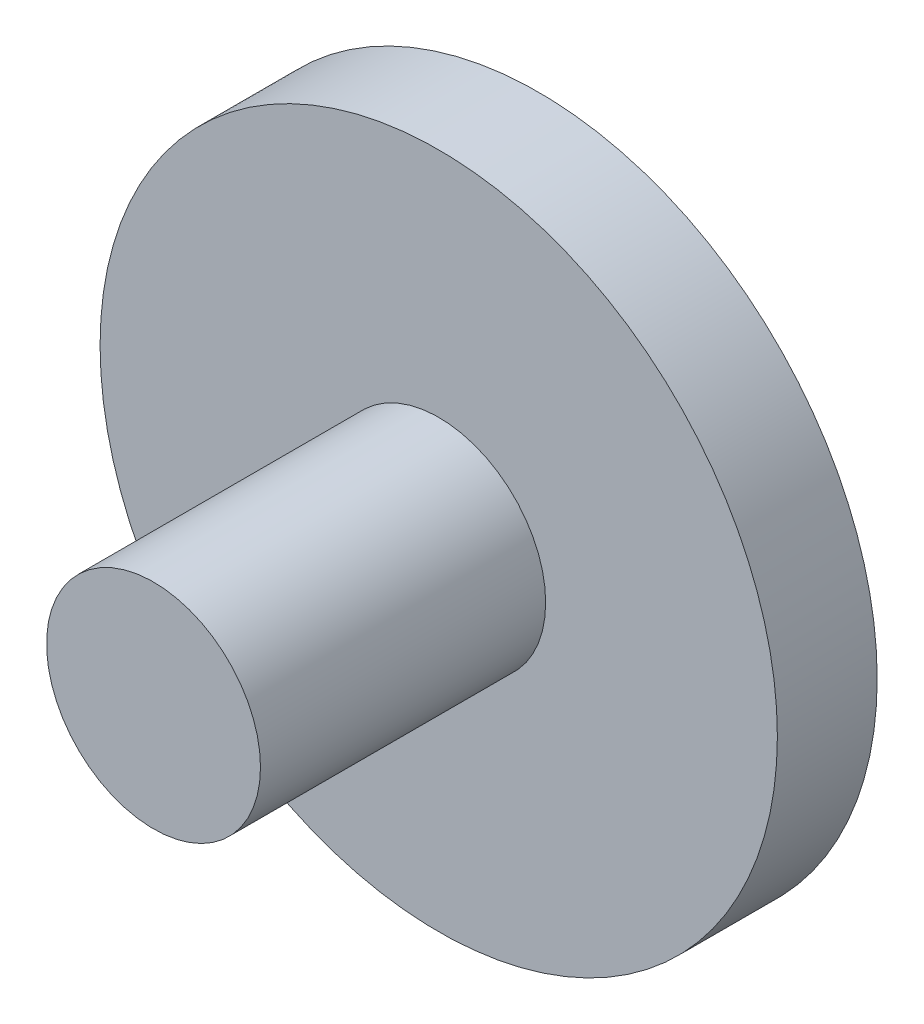
ISO-10303-21;
HEADER;
FILE_DESCRIPTION(('STEP AP214'),'2;1');
FILE_NAME('part.step','',(''),(''),'','','');
FILE_SCHEMA(('AUTOMOTIVE_DESIGN { 1 0 10303 214 1 1 1 1 }'));
ENDSEC;
DATA;
#1=APPLICATION_CONTEXT('core data for automotive mechanical design processes');
#2=APPLICATION_PROTOCOL_DEFINITION('international standard','automotive_design',2000,#1);
#3=PRODUCT_CONTEXT('',#1,'mechanical');
#4=PRODUCT('Part','Part','',(#3));
#5=PRODUCT_RELATED_PRODUCT_CATEGORY('part','',(#4));
#6=PRODUCT_DEFINITION_FORMATION('','',#4);
#7=PRODUCT_DEFINITION_CONTEXT('part definition',#1,'design');
#8=PRODUCT_DEFINITION('design','',#6,#7);
#9=PRODUCT_DEFINITION_SHAPE('','',#8);
#10=(LENGTH_UNIT() NAMED_UNIT(*) SI_UNIT(.MILLI.,.METRE.));
#11=(NAMED_UNIT(*) PLANE_ANGLE_UNIT() SI_UNIT($,.RADIAN.));
#12=(NAMED_UNIT(*) SI_UNIT($,.STERADIAN.) SOLID_ANGLE_UNIT());
#13=UNCERTAINTY_MEASURE_WITH_UNIT(LENGTH_MEASURE(1.E-05),#10,'distance_accuracy_value','');
#14=(GEOMETRIC_REPRESENTATION_CONTEXT(3) GLOBAL_UNCERTAINTY_ASSIGNED_CONTEXT((#13)) GLOBAL_UNIT_ASSIGNED_CONTEXT((#10,
#11,#12)) REPRESENTATION_CONTEXT('',''));
#15=CARTESIAN_POINT('',(0.,0.,0.));
#16=DIRECTION('',(0.,0.,1.));
#17=DIRECTION('',(1.,0.,0.));
#18=AXIS2_PLACEMENT_3D('',#15,#16,#17);
#19=CARTESIAN_POINT('',(0.,0.,0.));
#20=DIRECTION('',(0.,0.,1.));
#21=DIRECTION('',(1.,0.,0.));
#22=AXIS2_PLACEMENT_3D('',#19,#20,#21);
#23=PLANE('',#22);
#24=CARTESIAN_POINT('',(0.,0.,0.));
#25=DIRECTION('',(0.,0.,1.));
#26=DIRECTION('',(1.,0.,0.));
#27=AXIS2_PLACEMENT_3D('',#24,#25,#26);
#28=CIRCLE('',#27,4.75);
#29=CARTESIAN_POINT('',(4.75,0.,0.));
#30=VERTEX_POINT('',#29);
#31=EDGE_CURVE('E40',#30,#30,#28,.T.);
#32=ORIENTED_EDGE('',*,*,#31,.F.);
#33=EDGE_LOOP('',(#32));
#34=FACE_BOUND('',#33,.T.);
#35=DIRECTION('',(0.,1.,0.));
#36=VECTOR('',#35,1.);
#37=CARTESIAN_POINT('',(0.380174061926655,0.,0.));
#38=LINE('',#37,#36);
#39=CARTESIAN_POINT('',(0.380174061926655,0.31229172491184,0.));
#40=VERTEX_POINT('',#39);
#41=CARTESIAN_POINT('',(0.380174061926655,2.58391492168923,0.));
#42=VERTEX_POINT('',#41);
#43=EDGE_CURVE('E51',#40,#42,#38,.T.);
#44=ORIENTED_EDGE('',*,*,#43,.T.);
#45=DIRECTION('',(-1.,0.,0.));
#46=VECTOR('',#45,1.);
#47=CARTESIAN_POINT('',(0.,2.58391492168923,0.));
#48=LINE('',#47,#46);
#49=CARTESIAN_POINT('',(-0.380174061926655,2.58391492168923,0.));
#50=VERTEX_POINT('',#49);
#51=EDGE_CURVE('E101',#42,#50,#48,.T.);
#52=ORIENTED_EDGE('',*,*,#51,.T.);
#53=DIRECTION('',(0.,1.,0.));
#54=VECTOR('',#53,1.);
#55=CARTESIAN_POINT('',(-0.380174061926655,0.,0.));
#56=LINE('',#55,#54);
#57=CARTESIAN_POINT('',(-0.380174061926655,0.31229172491184,0.));
#58=VERTEX_POINT('',#57);
#59=EDGE_CURVE('E189',#58,#50,#56,.T.);
#60=ORIENTED_EDGE('',*,*,#59,.F.);
#61=DIRECTION('',(-1.,0.,0.));
#62=VECTOR('',#61,1.);
#63=CARTESIAN_POINT('',(0.,0.31229172491184,0.));
#64=LINE('',#63,#62);
#65=CARTESIAN_POINT('',(-1.51598566031535,0.31229172491184,0.));
#66=VERTEX_POINT('',#65);
#67=EDGE_CURVE('E141',#58,#66,#64,.T.);
#68=ORIENTED_EDGE('',*,*,#67,.T.);
#69=DIRECTION('',(0.,1.,0.));
#70=VECTOR('',#69,1.);
#71=CARTESIAN_POINT('',(-1.51598566031535,0.,0.));
#72=LINE('',#71,#70);
#73=CARTESIAN_POINT('',(-1.51598566031535,-0.312291724911838,0.));
#74=VERTEX_POINT('',#73);
#75=EDGE_CURVE('E185',#74,#66,#72,.T.);
#76=ORIENTED_EDGE('',*,*,#75,.F.);
#77=DIRECTION('',(-1.,0.,0.));
#78=VECTOR('',#77,1.);
#79=CARTESIAN_POINT('',(0.,-0.312291724911838,0.));
#80=LINE('',#79,#78);
#81=CARTESIAN_POINT('',(-0.380174061926655,-0.312291724911838,0.));
#82=VERTEX_POINT('',#81);
#83=EDGE_CURVE('E182',#82,#74,#80,.T.);
#84=ORIENTED_EDGE('',*,*,#83,.F.);
#85=DIRECTION('',(0.,1.,0.));
#86=VECTOR('',#85,1.);
#87=CARTESIAN_POINT('',(-0.380174061926655,0.,0.));
#88=LINE('',#87,#86);
#89=CARTESIAN_POINT('',(-0.380174061926655,-2.58391492168923,0.));
#90=VERTEX_POINT('',#89);
#91=EDGE_CURVE('E179',#90,#82,#88,.T.);
#92=ORIENTED_EDGE('',*,*,#91,.F.);
#93=DIRECTION('',(-1.,0.,0.));
#94=VECTOR('',#93,1.);
#95=CARTESIAN_POINT('',(0.,-2.58391492168923,0.));
#96=LINE('',#95,#94);
#97=CARTESIAN_POINT('',(0.380174061926655,-2.58391492168923,0.));
#98=VERTEX_POINT('',#97);
#99=EDGE_CURVE('E176',#98,#90,#96,.T.);
#100=ORIENTED_EDGE('',*,*,#99,.F.);
#101=DIRECTION('',(0.,1.,0.));
#102=VECTOR('',#101,1.);
#103=CARTESIAN_POINT('',(0.380174061926655,0.,0.));
#104=LINE('',#103,#102);
#105=CARTESIAN_POINT('',(0.380174061926655,-0.312291724911838,0.));
#106=VERTEX_POINT('',#105);
#107=EDGE_CURVE('E173',#98,#106,#104,.T.);
#108=ORIENTED_EDGE('',*,*,#107,.T.);
#109=DIRECTION('',(-1.,0.,0.));
#110=VECTOR('',#109,1.);
#111=CARTESIAN_POINT('',(0.,-0.312291724911838,0.));
#112=LINE('',#111,#110);
#113=CARTESIAN_POINT('',(1.51598566031535,-0.312291724911838,0.));
#114=VERTEX_POINT('',#113);
#115=EDGE_CURVE('E170',#114,#106,#112,.T.);
#116=ORIENTED_EDGE('',*,*,#115,.F.);
#117=DIRECTION('',(0.,1.,0.));
#118=VECTOR('',#117,1.);
#119=CARTESIAN_POINT('',(1.51598566031535,0.,0.));
#120=LINE('',#119,#118);
#121=CARTESIAN_POINT('',(1.51598566031535,0.31229172491184,0.));
#122=VERTEX_POINT('',#121);
#123=EDGE_CURVE('E167',#114,#122,#120,.T.);
#124=ORIENTED_EDGE('',*,*,#123,.T.);
#125=DIRECTION('',(-1.,0.,0.));
#126=VECTOR('',#125,1.);
#127=CARTESIAN_POINT('',(0.,0.31229172491184,0.));
#128=LINE('',#127,#126);
#129=EDGE_CURVE('E164',#122,#40,#128,.T.);
#130=ORIENTED_EDGE('',*,*,#129,.T.);
#131=EDGE_LOOP('',(#44,#52,#60,#68,#76,#84,#92,#100,#108,#116,#124,#130));
#132=FACE_BOUND('',#131,.T.);
#133=ADVANCED_FACE('F36',(#34,#132),#23,.F.);
#134=CARTESIAN_POINT('',(0.,0.,1.4));
#135=DIRECTION('',(0.,0.,-1.));
#136=DIRECTION('',(-1.,0.,0.));
#137=AXIS2_PLACEMENT_3D('',#134,#135,#136);
#138=CYLINDRICAL_SURFACE('',#137,4.75);
#139=CARTESIAN_POINT('',(0.,0.,1.4));
#140=DIRECTION('',(0.,0.,1.));
#141=DIRECTION('',(1.,0.,0.));
#142=AXIS2_PLACEMENT_3D('',#139,#140,#141);
#143=CIRCLE('',#142,4.75);
#144=CARTESIAN_POINT('',(4.75,0.,1.4));
#145=VERTEX_POINT('',#144);
#146=EDGE_CURVE('E11',#145,#145,#143,.T.);
#147=ORIENTED_EDGE('',*,*,#146,.F.);
#148=EDGE_LOOP('',(#147));
#149=FACE_BOUND('',#148,.T.);
#150=ORIENTED_EDGE('',*,*,#31,.T.);
#151=EDGE_LOOP('',(#150));
#152=FACE_BOUND('',#151,.T.);
#153=ADVANCED_FACE('F38',(#149,#152),#138,.T.);
#154=CARTESIAN_POINT('',(0.,0.,1.4));
#155=DIRECTION('',(0.,0.,1.));
#156=DIRECTION('',(1.,0.,0.));
#157=AXIS2_PLACEMENT_3D('',#154,#155,#156);
#158=PLANE('',#157);
#159=CARTESIAN_POINT('',(0.,0.,1.4));
#160=DIRECTION('',(0.,0.,1.));
#161=DIRECTION('',(1.,0.,0.));
#162=AXIS2_PLACEMENT_3D('',#159,#160,#161);
#163=CIRCLE('',#162,1.5);
#164=CARTESIAN_POINT('',(1.5,0.,1.4));
#165=VERTEX_POINT('',#164);
#166=EDGE_CURVE('E195',#165,#165,#163,.T.);
#167=ORIENTED_EDGE('',*,*,#166,.F.);
#168=EDGE_LOOP('',(#167));
#169=FACE_BOUND('',#168,.T.);
#170=ORIENTED_EDGE('',*,*,#146,.T.);
#171=EDGE_LOOP('',(#170));
#172=FACE_BOUND('',#171,.T.);
#173=ADVANCED_FACE('F221',(#169,#172),#158,.T.);
#174=CARTESIAN_POINT('',(0.,0.,5.4));
#175=DIRECTION('',(0.,0.,-1.));
#176=DIRECTION('',(-1.,0.,0.));
#177=AXIS2_PLACEMENT_3D('',#174,#175,#176);
#178=CYLINDRICAL_SURFACE('',#177,1.5);
#179=CARTESIAN_POINT('',(0.,0.,5.4));
#180=DIRECTION('',(0.,0.,1.));
#181=DIRECTION('',(1.,0.,0.));
#182=AXIS2_PLACEMENT_3D('',#179,#180,#181);
#183=CIRCLE('',#182,1.5);
#184=CARTESIAN_POINT('',(1.5,0.,5.4));
#185=VERTEX_POINT('',#184);
#186=EDGE_CURVE('E213',#185,#185,#183,.T.);
#187=ORIENTED_EDGE('',*,*,#186,.F.);
#188=EDGE_LOOP('',(#187));
#189=FACE_BOUND('',#188,.T.);
#190=ORIENTED_EDGE('',*,*,#166,.T.);
#191=EDGE_LOOP('',(#190));
#192=FACE_BOUND('',#191,.T.);
#193=ADVANCED_FACE('F219',(#189,#192),#178,.T.);
#194=CARTESIAN_POINT('',(0.,0.,5.4));
#195=DIRECTION('',(0.,0.,1.));
#196=DIRECTION('',(1.,0.,0.));
#197=AXIS2_PLACEMENT_3D('',#194,#195,#196);
#198=PLANE('',#197);
#199=ORIENTED_EDGE('',*,*,#186,.T.);
#200=EDGE_LOOP('',(#199));
#201=FACE_BOUND('',#200,.T.);
#202=ADVANCED_FACE('F295',(#201),#198,.T.);
#203=CARTESIAN_POINT('',(0.380174061926655,0.,1.));
#204=DIRECTION('',(-1.,0.,0.));
#205=DIRECTION('',(0.,0.,1.));
#206=AXIS2_PLACEMENT_3D('',#203,#204,#205);
#207=PLANE('',#206);
#208=ORIENTED_EDGE('',*,*,#43,.F.);
#209=DIRECTION('',(0.,0.,-1.));
#210=VECTOR('',#209,1.);
#211=CARTESIAN_POINT('',(0.380174061926655,0.31229172491184,1.));
#212=LINE('',#211,#210);
#213=CARTESIAN_POINT('',(0.380174061926655,0.31229172491184,1.));
#214=VERTEX_POINT('',#213);
#215=EDGE_CURVE('E159',#214,#40,#212,.T.);
#216=ORIENTED_EDGE('',*,*,#215,.F.);
#217=DIRECTION('',(0.,1.,0.));
#218=VECTOR('',#217,1.);
#219=CARTESIAN_POINT('',(0.380174061926655,0.,1.));
#220=LINE('',#219,#218);
#221=CARTESIAN_POINT('',(0.380174061926655,2.58391492168923,1.));
#222=VERTEX_POINT('',#221);
#223=EDGE_CURVE('E192',#214,#222,#220,.T.);
#224=ORIENTED_EDGE('',*,*,#223,.T.);
#225=DIRECTION('',(0.,0.,-1.));
#226=VECTOR('',#225,1.);
#227=CARTESIAN_POINT('',(0.380174061926655,2.58391492168923,1.));
#228=LINE('',#227,#226);
#229=EDGE_CURVE('E193',#222,#42,#228,.T.);
#230=ORIENTED_EDGE('',*,*,#229,.T.);
#231=EDGE_LOOP('',(#208,#216,#224,#230));
#232=FACE_BOUND('',#231,.T.);
#233=ADVANCED_FACE('F238',(#232),#207,.T.);
#234=CARTESIAN_POINT('',(0.,2.58391492168923,1.));
#235=DIRECTION('',(0.,-1.,0.));
#236=DIRECTION('',(0.,0.,-1.));
#237=AXIS2_PLACEMENT_3D('',#234,#235,#236);
#238=PLANE('',#237);
#239=ORIENTED_EDGE('',*,*,#51,.F.);
#240=ORIENTED_EDGE('',*,*,#229,.F.);
#241=DIRECTION('',(-1.,0.,0.));
#242=VECTOR('',#241,1.);
#243=CARTESIAN_POINT('',(0.,2.58391492168923,1.));
#244=LINE('',#243,#242);
#245=CARTESIAN_POINT('',(-0.380174061926655,2.58391492168923,1.));
#246=VERTEX_POINT('',#245);
#247=EDGE_CURVE('E60',#222,#246,#244,.T.);
#248=ORIENTED_EDGE('',*,*,#247,.T.);
#249=DIRECTION('',(0.,0.,-1.));
#250=VECTOR('',#249,1.);
#251=CARTESIAN_POINT('',(-0.380174061926655,2.58391492168923,1.));
#252=LINE('',#251,#250);
#253=EDGE_CURVE('E146',#246,#50,#252,.T.);
#254=ORIENTED_EDGE('',*,*,#253,.T.);
#255=EDGE_LOOP('',(#239,#240,#248,#254));
#256=FACE_BOUND('',#255,.T.);
#257=ADVANCED_FACE('F294',(#256),#238,.T.);
#258=CARTESIAN_POINT('',(-0.380174061926655,0.,1.));
#259=DIRECTION('',(-1.,0.,0.));
#260=DIRECTION('',(0.,0.,1.));
#261=AXIS2_PLACEMENT_3D('',#258,#259,#260);
#262=PLANE('',#261);
#263=ORIENTED_EDGE('',*,*,#59,.T.);
#264=ORIENTED_EDGE('',*,*,#253,.F.);
#265=DIRECTION('',(0.,1.,0.));
#266=VECTOR('',#265,1.);
#267=CARTESIAN_POINT('',(-0.380174061926655,0.,1.));
#268=LINE('',#267,#266);
#269=CARTESIAN_POINT('',(-0.380174061926655,0.31229172491184,1.));
#270=VERTEX_POINT('',#269);
#271=EDGE_CURVE('E151',#270,#246,#268,.T.);
#272=ORIENTED_EDGE('',*,*,#271,.F.);
#273=DIRECTION('',(0.,0.,-1.));
#274=VECTOR('',#273,1.);
#275=CARTESIAN_POINT('',(-0.380174061926655,0.31229172491184,1.));
#276=LINE('',#275,#274);
#277=EDGE_CURVE('E135',#270,#58,#276,.T.);
#278=ORIENTED_EDGE('',*,*,#277,.T.);
#279=EDGE_LOOP('',(#263,#264,#272,#278));
#280=FACE_BOUND('',#279,.T.);
#281=ADVANCED_FACE('F157',(#280),#262,.F.);
#282=CARTESIAN_POINT('',(0.,0.31229172491184,1.));
#283=DIRECTION('',(0.,-1.,0.));
#284=DIRECTION('',(0.,0.,-1.));
#285=AXIS2_PLACEMENT_3D('',#282,#283,#284);
#286=PLANE('',#285);
#287=ORIENTED_EDGE('',*,*,#67,.F.);
#288=ORIENTED_EDGE('',*,*,#277,.F.);
#289=DIRECTION('',(-1.,0.,0.));
#290=VECTOR('',#289,1.);
#291=CARTESIAN_POINT('',(0.,0.31229172491184,1.));
#292=LINE('',#291,#290);
#293=CARTESIAN_POINT('',(-1.51598566031535,0.31229172491184,1.));
#294=VERTEX_POINT('',#293);
#295=EDGE_CURVE('E138',#270,#294,#292,.T.);
#296=ORIENTED_EDGE('',*,*,#295,.T.);
#297=DIRECTION('',(0.,0.,-1.));
#298=VECTOR('',#297,1.);
#299=CARTESIAN_POINT('',(-1.51598566031535,0.31229172491184,1.));
#300=LINE('',#299,#298);
#301=EDGE_CURVE('E147',#294,#66,#300,.T.);
#302=ORIENTED_EDGE('',*,*,#301,.T.);
#303=EDGE_LOOP('',(#287,#288,#296,#302));
#304=FACE_BOUND('',#303,.T.);
#305=ADVANCED_FACE('F137',(#304),#286,.T.);
#306=CARTESIAN_POINT('',(-1.51598566031535,0.,1.));
#307=DIRECTION('',(-1.,0.,0.));
#308=DIRECTION('',(0.,0.,1.));
#309=AXIS2_PLACEMENT_3D('',#306,#307,#308);
#310=PLANE('',#309);
#311=ORIENTED_EDGE('',*,*,#75,.T.);
#312=ORIENTED_EDGE('',*,*,#301,.F.);
#313=DIRECTION('',(0.,1.,0.));
#314=VECTOR('',#313,1.);
#315=CARTESIAN_POINT('',(-1.51598566031535,0.,1.));
#316=LINE('',#315,#314);
#317=CARTESIAN_POINT('',(-1.51598566031535,-0.312291724911838,1.));
#318=VERTEX_POINT('',#317);
#319=EDGE_CURVE('E154',#318,#294,#316,.T.);
#320=ORIENTED_EDGE('',*,*,#319,.F.);
#321=DIRECTION('',(0.,0.,-1.));
#322=VECTOR('',#321,1.);
#323=CARTESIAN_POINT('',(-1.51598566031535,-0.312291724911838,1.));
#324=LINE('',#323,#322);
#325=EDGE_CURVE('E198',#318,#74,#324,.T.);
#326=ORIENTED_EDGE('',*,*,#325,.T.);
#327=EDGE_LOOP('',(#311,#312,#320,#326));
#328=FACE_BOUND('',#327,.T.);
#329=ADVANCED_FACE('F264',(#328),#310,.F.);
#330=CARTESIAN_POINT('',(0.,-0.312291724911838,1.));
#331=DIRECTION('',(0.,-1.,0.));
#332=DIRECTION('',(0.,0.,-1.));
#333=AXIS2_PLACEMENT_3D('',#330,#331,#332);
#334=PLANE('',#333);
#335=ORIENTED_EDGE('',*,*,#83,.T.);
#336=ORIENTED_EDGE('',*,*,#325,.F.);
#337=DIRECTION('',(-1.,0.,0.));
#338=VECTOR('',#337,1.);
#339=CARTESIAN_POINT('',(0.,-0.312291724911838,1.));
#340=LINE('',#339,#338);
#341=CARTESIAN_POINT('',(-0.380174061926655,-0.312291724911838,1.));
#342=VERTEX_POINT('',#341);
#343=EDGE_CURVE('E256',#342,#318,#340,.T.);
#344=ORIENTED_EDGE('',*,*,#343,.F.);
#345=DIRECTION('',(0.,0.,-1.));
#346=VECTOR('',#345,1.);
#347=CARTESIAN_POINT('',(-0.380174061926655,-0.312291724911838,1.));
#348=LINE('',#347,#346);
#349=EDGE_CURVE('E200',#342,#82,#348,.T.);
#350=ORIENTED_EDGE('',*,*,#349,.T.);
#351=EDGE_LOOP('',(#335,#336,#344,#350));
#352=FACE_BOUND('',#351,.T.);
#353=ADVANCED_FACE('F260',(#352),#334,.F.);
#354=CARTESIAN_POINT('',(-0.380174061926655,0.,1.));
#355=DIRECTION('',(-1.,0.,0.));
#356=DIRECTION('',(0.,0.,1.));
#357=AXIS2_PLACEMENT_3D('',#354,#355,#356);
#358=PLANE('',#357);
#359=ORIENTED_EDGE('',*,*,#91,.T.);
#360=ORIENTED_EDGE('',*,*,#349,.F.);
#361=DIRECTION('',(0.,1.,0.));
#362=VECTOR('',#361,1.);
#363=CARTESIAN_POINT('',(-0.380174061926655,0.,1.));
#364=LINE('',#363,#362);
#365=CARTESIAN_POINT('',(-0.380174061926655,-2.58391492168923,1.));
#366=VERTEX_POINT('',#365);
#367=EDGE_CURVE('E253',#366,#342,#364,.T.);
#368=ORIENTED_EDGE('',*,*,#367,.F.);
#369=DIRECTION('',(0.,0.,-1.));
#370=VECTOR('',#369,1.);
#371=CARTESIAN_POINT('',(-0.380174061926655,-2.58391492168923,1.));
#372=LINE('',#371,#370);
#373=EDGE_CURVE('E202',#366,#90,#372,.T.);
#374=ORIENTED_EDGE('',*,*,#373,.T.);
#375=EDGE_LOOP('',(#359,#360,#368,#374));
#376=FACE_BOUND('',#375,.T.);
#377=ADVANCED_FACE('F268',(#376),#358,.F.);
#378=CARTESIAN_POINT('',(0.,-2.58391492168923,1.));
#379=DIRECTION('',(0.,-1.,0.));
#380=DIRECTION('',(0.,0.,-1.));
#381=AXIS2_PLACEMENT_3D('',#378,#379,#380);
#382=PLANE('',#381);
#383=ORIENTED_EDGE('',*,*,#99,.T.);
#384=ORIENTED_EDGE('',*,*,#373,.F.);
#385=DIRECTION('',(-1.,0.,0.));
#386=VECTOR('',#385,1.);
#387=CARTESIAN_POINT('',(0.,-2.58391492168923,1.));
#388=LINE('',#387,#386);
#389=CARTESIAN_POINT('',(0.380174061926655,-2.58391492168923,1.));
#390=VERTEX_POINT('',#389);
#391=EDGE_CURVE('E250',#390,#366,#388,.T.);
#392=ORIENTED_EDGE('',*,*,#391,.F.);
#393=DIRECTION('',(0.,0.,-1.));
#394=VECTOR('',#393,1.);
#395=CARTESIAN_POINT('',(0.380174061926655,-2.58391492168923,1.));
#396=LINE('',#395,#394);
#397=EDGE_CURVE('E204',#390,#98,#396,.T.);
#398=ORIENTED_EDGE('',*,*,#397,.T.);
#399=EDGE_LOOP('',(#383,#384,#392,#398));
#400=FACE_BOUND('',#399,.T.);
#401=ADVANCED_FACE('F271',(#400),#382,.F.);
#402=CARTESIAN_POINT('',(0.380174061926655,0.,1.));
#403=DIRECTION('',(-1.,0.,0.));
#404=DIRECTION('',(0.,0.,1.));
#405=AXIS2_PLACEMENT_3D('',#402,#403,#404);
#406=PLANE('',#405);
#407=ORIENTED_EDGE('',*,*,#107,.F.);
#408=ORIENTED_EDGE('',*,*,#397,.F.);
#409=DIRECTION('',(0.,1.,0.));
#410=VECTOR('',#409,1.);
#411=CARTESIAN_POINT('',(0.380174061926655,0.,1.));
#412=LINE('',#411,#410);
#413=CARTESIAN_POINT('',(0.380174061926655,-0.312291724911838,1.));
#414=VERTEX_POINT('',#413);
#415=EDGE_CURVE('E248',#390,#414,#412,.T.);
#416=ORIENTED_EDGE('',*,*,#415,.T.);
#417=DIRECTION('',(0.,0.,-1.));
#418=VECTOR('',#417,1.);
#419=CARTESIAN_POINT('',(0.380174061926655,-0.312291724911838,1.));
#420=LINE('',#419,#418);
#421=EDGE_CURVE('E206',#414,#106,#420,.T.);
#422=ORIENTED_EDGE('',*,*,#421,.T.);
#423=EDGE_LOOP('',(#407,#408,#416,#422));
#424=FACE_BOUND('',#423,.T.);
#425=ADVANCED_FACE('F275',(#424),#406,.T.);
#426=CARTESIAN_POINT('',(0.,-0.312291724911838,1.));
#427=DIRECTION('',(0.,-1.,0.));
#428=DIRECTION('',(0.,0.,-1.));
#429=AXIS2_PLACEMENT_3D('',#426,#427,#428);
#430=PLANE('',#429);
#431=ORIENTED_EDGE('',*,*,#115,.T.);
#432=ORIENTED_EDGE('',*,*,#421,.F.);
#433=DIRECTION('',(-1.,0.,0.));
#434=VECTOR('',#433,1.);
#435=CARTESIAN_POINT('',(0.,-0.312291724911838,1.));
#436=LINE('',#435,#434);
#437=CARTESIAN_POINT('',(1.51598566031535,-0.312291724911838,1.));
#438=VERTEX_POINT('',#437);
#439=EDGE_CURVE('E245',#438,#414,#436,.T.);
#440=ORIENTED_EDGE('',*,*,#439,.F.);
#441=DIRECTION('',(0.,0.,-1.));
#442=VECTOR('',#441,1.);
#443=CARTESIAN_POINT('',(1.51598566031535,-0.312291724911838,1.));
#444=LINE('',#443,#442);
#445=EDGE_CURVE('E208',#438,#114,#444,.T.);
#446=ORIENTED_EDGE('',*,*,#445,.T.);
#447=EDGE_LOOP('',(#431,#432,#440,#446));
#448=FACE_BOUND('',#447,.T.);
#449=ADVANCED_FACE('F278',(#448),#430,.F.);
#450=CARTESIAN_POINT('',(1.51598566031535,0.,1.));
#451=DIRECTION('',(-1.,0.,0.));
#452=DIRECTION('',(0.,0.,1.));
#453=AXIS2_PLACEMENT_3D('',#450,#451,#452);
#454=PLANE('',#453);
#455=ORIENTED_EDGE('',*,*,#123,.F.);
#456=ORIENTED_EDGE('',*,*,#445,.F.);
#457=DIRECTION('',(0.,1.,0.));
#458=VECTOR('',#457,1.);
#459=CARTESIAN_POINT('',(1.51598566031535,0.,1.));
#460=LINE('',#459,#458);
#461=CARTESIAN_POINT('',(1.51598566031535,0.31229172491184,1.));
#462=VERTEX_POINT('',#461);
#463=EDGE_CURVE('E241',#438,#462,#460,.T.);
#464=ORIENTED_EDGE('',*,*,#463,.T.);
#465=DIRECTION('',(0.,0.,-1.));
#466=VECTOR('',#465,1.);
#467=CARTESIAN_POINT('',(1.51598566031535,0.31229172491184,1.));
#468=LINE('',#467,#466);
#469=EDGE_CURVE('E210',#462,#122,#468,.T.);
#470=ORIENTED_EDGE('',*,*,#469,.T.);
#471=EDGE_LOOP('',(#455,#456,#464,#470));
#472=FACE_BOUND('',#471,.T.);
#473=ADVANCED_FACE('F281',(#472),#454,.T.);
#474=CARTESIAN_POINT('',(0.,0.31229172491184,1.));
#475=DIRECTION('',(0.,-1.,0.));
#476=DIRECTION('',(0.,0.,-1.));
#477=AXIS2_PLACEMENT_3D('',#474,#475,#476);
#478=PLANE('',#477);
#479=ORIENTED_EDGE('',*,*,#129,.F.);
#480=ORIENTED_EDGE('',*,*,#469,.F.);
#481=DIRECTION('',(-1.,0.,0.));
#482=VECTOR('',#481,1.);
#483=CARTESIAN_POINT('',(0.,0.31229172491184,1.));
#484=LINE('',#483,#482);
#485=EDGE_CURVE('E108',#462,#214,#484,.T.);
#486=ORIENTED_EDGE('',*,*,#485,.T.);
#487=ORIENTED_EDGE('',*,*,#215,.T.);
#488=EDGE_LOOP('',(#479,#480,#486,#487));
#489=FACE_BOUND('',#488,.T.);
#490=ADVANCED_FACE('F237',(#489),#478,.T.);
#491=CARTESIAN_POINT('',(0.,0.,1.));
#492=DIRECTION('',(0.,0.,-1.));
#493=DIRECTION('',(-1.,0.,0.));
#494=AXIS2_PLACEMENT_3D('',#491,#492,#493);
#495=PLANE('',#494);
#496=ORIENTED_EDGE('',*,*,#223,.F.);
#497=ORIENTED_EDGE('',*,*,#485,.F.);
#498=ORIENTED_EDGE('',*,*,#463,.F.);
#499=ORIENTED_EDGE('',*,*,#439,.T.);
#500=ORIENTED_EDGE('',*,*,#415,.F.);
#501=ORIENTED_EDGE('',*,*,#391,.T.);
#502=ORIENTED_EDGE('',*,*,#367,.T.);
#503=ORIENTED_EDGE('',*,*,#343,.T.);
#504=ORIENTED_EDGE('',*,*,#319,.T.);
#505=ORIENTED_EDGE('',*,*,#295,.F.);
#506=ORIENTED_EDGE('',*,*,#271,.T.);
#507=ORIENTED_EDGE('',*,*,#247,.F.);
#508=EDGE_LOOP('',(#496,#497,#498,#499,#500,#501,#502,#503,#504,#505,#506,#507));
#509=FACE_BOUND('',#508,.T.);
#510=ADVANCED_FACE('F150',(#509),#495,.T.);
#511=CLOSED_SHELL('',(#133,#153,#173,#193,#202,#233,#257,#281,#305,#329,#353,#377,#401,#425,
#449,#473,#490,#510));
#512=MANIFOLD_SOLID_BREP('B2',#511);
#513=ADVANCED_BREP_SHAPE_REPRESENTATION('',(#18,#512),#14);
#514=SHAPE_DEFINITION_REPRESENTATION(#9,#513);
ENDSEC;
END-ISO-10303-21;
